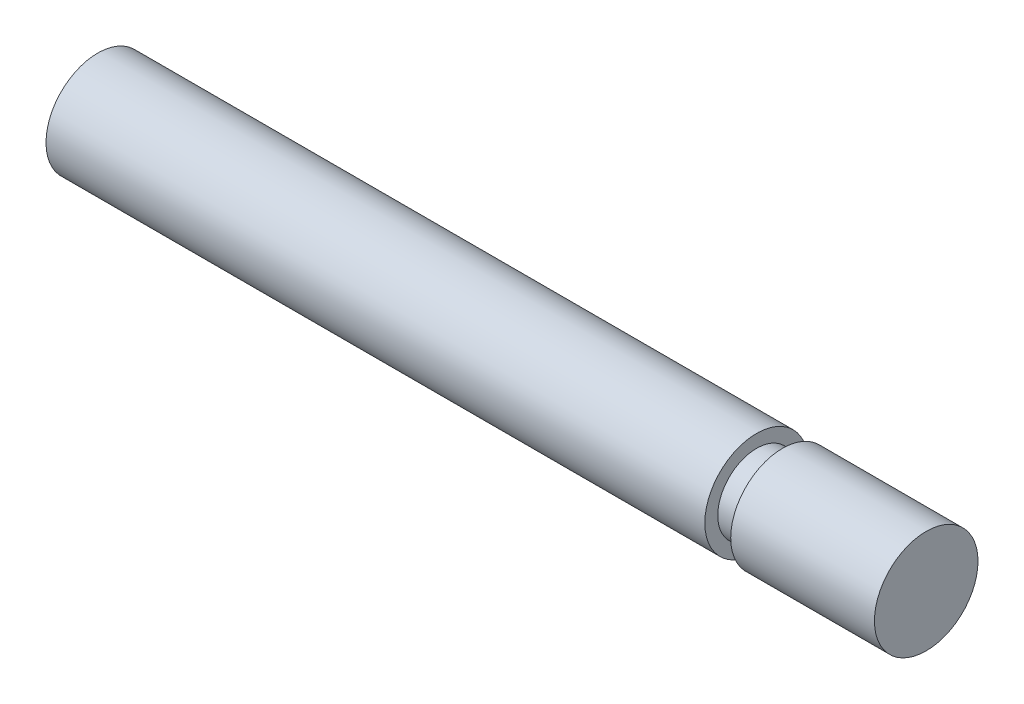
ISO-10303-21;
HEADER;
FILE_DESCRIPTION(('STEP AP214'),'2;1');
FILE_NAME('part.step','',(''),(''),'','','');
FILE_SCHEMA(('AUTOMOTIVE_DESIGN { 1 0 10303 214 1 1 1 1 }'));
ENDSEC;
DATA;
#1=APPLICATION_CONTEXT('core data for automotive mechanical design processes');
#2=APPLICATION_PROTOCOL_DEFINITION('international standard','automotive_design',2000,#1);
#3=PRODUCT_CONTEXT('',#1,'mechanical');
#4=PRODUCT('Part','Part','',(#3));
#5=PRODUCT_RELATED_PRODUCT_CATEGORY('part','',(#4));
#6=PRODUCT_DEFINITION_FORMATION('','',#4);
#7=PRODUCT_DEFINITION_CONTEXT('part definition',#1,'design');
#8=PRODUCT_DEFINITION('design','',#6,#7);
#9=PRODUCT_DEFINITION_SHAPE('','',#8);
#10=(LENGTH_UNIT() NAMED_UNIT(*) SI_UNIT(.MILLI.,.METRE.));
#11=(NAMED_UNIT(*) PLANE_ANGLE_UNIT() SI_UNIT($,.RADIAN.));
#12=(NAMED_UNIT(*) SI_UNIT($,.STERADIAN.) SOLID_ANGLE_UNIT());
#13=UNCERTAINTY_MEASURE_WITH_UNIT(LENGTH_MEASURE(1.E-05),#10,'distance_accuracy_value','');
#14=(GEOMETRIC_REPRESENTATION_CONTEXT(3) GLOBAL_UNCERTAINTY_ASSIGNED_CONTEXT((#13)) GLOBAL_UNIT_ASSIGNED_CONTEXT((#10,
#11,#12)) REPRESENTATION_CONTEXT('',''));
#15=CARTESIAN_POINT('',(0.,0.,0.));
#16=DIRECTION('',(0.,0.,1.));
#17=DIRECTION('',(1.,0.,0.));
#18=AXIS2_PLACEMENT_3D('',#15,#16,#17);
#19=CARTESIAN_POINT('',(0.,0.,0.));
#20=DIRECTION('',(-1.,0.,0.));
#21=DIRECTION('',(0.,0.,1.));
#22=AXIS2_PLACEMENT_3D('',#19,#20,#21);
#23=CYLINDRICAL_SURFACE('',#22,50.);
#24=CARTESIAN_POINT('',(661.2,0.,0.));
#25=DIRECTION('',(-1.,0.,0.));
#26=DIRECTION('',(0.,0.,1.));
#27=AXIS2_PLACEMENT_3D('',#24,#25,#26);
#28=CIRCLE('',#27,50.);
#29=CARTESIAN_POINT('',(661.2,0.,50.));
#30=VERTEX_POINT('',#29);
#31=EDGE_CURVE('E12',#30,#30,#28,.T.);
#32=ORIENTED_EDGE('',*,*,#31,.F.);
#33=EDGE_LOOP('',(#32));
#34=FACE_BOUND('',#33,.T.);
#35=CARTESIAN_POINT('',(800.,0.,0.));
#36=DIRECTION('',(1.,0.,0.));
#37=DIRECTION('',(0.,0.,-1.));
#38=AXIS2_PLACEMENT_3D('',#35,#36,#37);
#39=CIRCLE('',#38,50.);
#40=CARTESIAN_POINT('',(800.,0.,-50.));
#41=VERTEX_POINT('',#40);
#42=EDGE_CURVE('E64',#41,#41,#39,.T.);
#43=ORIENTED_EDGE('',*,*,#42,.F.);
#44=EDGE_LOOP('',(#43));
#45=FACE_BOUND('',#44,.T.);
#46=ADVANCED_FACE('F42',(#34,#45),#23,.T.);
#47=CARTESIAN_POINT('',(661.2,50.,0.));
#48=DIRECTION('',(1.,0.,0.));
#49=DIRECTION('',(0.,0.,-1.));
#50=AXIS2_PLACEMENT_3D('',#47,#48,#49);
#51=PLANE('',#50);
#52=CARTESIAN_POINT('',(661.2,0.,0.));
#53=DIRECTION('',(-1.,0.,0.));
#54=DIRECTION('',(0.,0.,1.));
#55=AXIS2_PLACEMENT_3D('',#52,#53,#54);
#56=CIRCLE('',#55,37.5);
#57=CARTESIAN_POINT('',(661.2,0.,37.5));
#58=VERTEX_POINT('',#57);
#59=EDGE_CURVE('E48',#58,#58,#56,.T.);
#60=ORIENTED_EDGE('',*,*,#59,.F.);
#61=EDGE_LOOP('',(#60));
#62=FACE_BOUND('',#61,.T.);
#63=ORIENTED_EDGE('',*,*,#31,.T.);
#64=EDGE_LOOP('',(#63));
#65=FACE_BOUND('',#64,.T.);
#66=ADVANCED_FACE('F71',(#62,#65),#51,.F.);
#67=CARTESIAN_POINT('',(0.,0.,0.));
#68=DIRECTION('',(-1.,0.,0.));
#69=DIRECTION('',(0.,0.,1.));
#70=AXIS2_PLACEMENT_3D('',#67,#68,#69);
#71=CYLINDRICAL_SURFACE('',#70,37.5);
#72=CARTESIAN_POINT('',(636.2,0.,0.));
#73=DIRECTION('',(-1.,0.,0.));
#74=DIRECTION('',(0.,0.,1.));
#75=AXIS2_PLACEMENT_3D('',#72,#73,#74);
#76=CIRCLE('',#75,37.5);
#77=CARTESIAN_POINT('',(636.2,0.,37.5));
#78=VERTEX_POINT('',#77);
#79=EDGE_CURVE('E52',#78,#78,#76,.T.);
#80=ORIENTED_EDGE('',*,*,#79,.F.);
#81=EDGE_LOOP('',(#80));
#82=FACE_BOUND('',#81,.T.);
#83=ORIENTED_EDGE('',*,*,#59,.T.);
#84=EDGE_LOOP('',(#83));
#85=FACE_BOUND('',#84,.T.);
#86=ADVANCED_FACE('F76',(#82,#85),#71,.T.);
#87=CARTESIAN_POINT('',(636.2,37.5,0.));
#88=DIRECTION('',(-1.,0.,0.));
#89=DIRECTION('',(0.,0.,1.));
#90=AXIS2_PLACEMENT_3D('',#87,#88,#89);
#91=PLANE('',#90);
#92=CARTESIAN_POINT('',(636.2,0.,0.));
#93=DIRECTION('',(-1.,0.,0.));
#94=DIRECTION('',(0.,0.,1.));
#95=AXIS2_PLACEMENT_3D('',#92,#93,#94);
#96=CIRCLE('',#95,50.);
#97=CARTESIAN_POINT('',(636.2,0.,50.));
#98=VERTEX_POINT('',#97);
#99=EDGE_CURVE('E56',#98,#98,#96,.T.);
#100=ORIENTED_EDGE('',*,*,#99,.F.);
#101=EDGE_LOOP('',(#100));
#102=FACE_BOUND('',#101,.T.);
#103=ORIENTED_EDGE('',*,*,#79,.T.);
#104=EDGE_LOOP('',(#103));
#105=FACE_BOUND('',#104,.T.);
#106=ADVANCED_FACE('F81',(#102,#105),#91,.F.);
#107=CARTESIAN_POINT('',(0.,0.,0.));
#108=DIRECTION('',(-1.,0.,0.));
#109=DIRECTION('',(0.,0.,1.));
#110=AXIS2_PLACEMENT_3D('',#107,#108,#109);
#111=CYLINDRICAL_SURFACE('',#110,50.);
#112=CARTESIAN_POINT('',(0.,0.,0.));
#113=DIRECTION('',(-1.,0.,0.));
#114=DIRECTION('',(0.,0.,1.));
#115=AXIS2_PLACEMENT_3D('',#112,#113,#114);
#116=CIRCLE('',#115,50.);
#117=CARTESIAN_POINT('',(0.,0.,50.));
#118=VERTEX_POINT('',#117);
#119=EDGE_CURVE('E61',#118,#118,#116,.T.);
#120=ORIENTED_EDGE('',*,*,#119,.F.);
#121=EDGE_LOOP('',(#120));
#122=FACE_BOUND('',#121,.T.);
#123=ORIENTED_EDGE('',*,*,#99,.T.);
#124=EDGE_LOOP('',(#123));
#125=FACE_BOUND('',#124,.T.);
#126=ADVANCED_FACE('F87',(#122,#125),#111,.T.);
#127=CARTESIAN_POINT('',(0.,0.,0.));
#128=DIRECTION('',(1.,0.,0.));
#129=DIRECTION('',(0.,0.,-1.));
#130=AXIS2_PLACEMENT_3D('',#127,#128,#129);
#131=PLANE('',#130);
#132=ORIENTED_EDGE('',*,*,#119,.T.);
#133=EDGE_LOOP('',(#132));
#134=FACE_BOUND('',#133,.T.);
#135=ADVANCED_FACE('F91',(#134),#131,.F.);
#136=CARTESIAN_POINT('',(800.,0.,0.));
#137=DIRECTION('',(1.,0.,0.));
#138=DIRECTION('',(0.,0.,-1.));
#139=AXIS2_PLACEMENT_3D('',#136,#137,#138);
#140=PLANE('',#139);
#141=ORIENTED_EDGE('',*,*,#42,.T.);
#142=EDGE_LOOP('',(#141));
#143=FACE_BOUND('',#142,.T.);
#144=ADVANCED_FACE('F68',(#143),#140,.T.);
#145=CLOSED_SHELL('',(#46,#66,#86,#106,#126,#135,#144));
#146=MANIFOLD_SOLID_BREP('B2',#145);
#147=ADVANCED_BREP_SHAPE_REPRESENTATION('',(#18,#146),#14);
#148=SHAPE_DEFINITION_REPRESENTATION(#9,#147);
ENDSEC;
END-ISO-10303-21;
